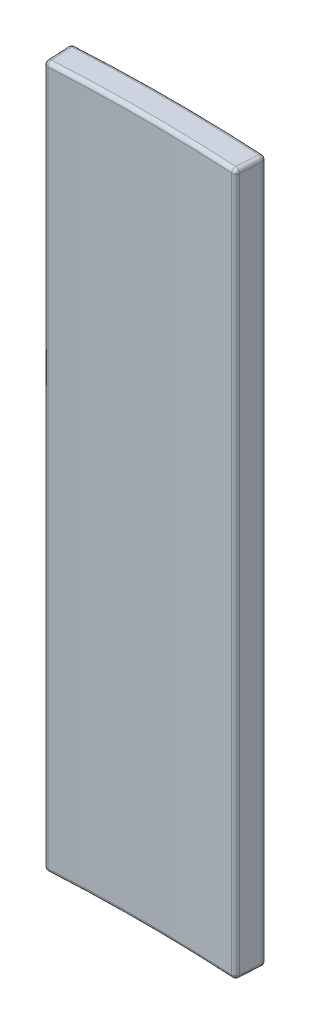
ISO-10303-21;
HEADER;
FILE_DESCRIPTION(('STEP AP214'),'2;1');
FILE_NAME('part.step','',(''),(''),'','','');
FILE_SCHEMA(('AUTOMOTIVE_DESIGN { 1 0 10303 214 1 1 1 1 }'));
ENDSEC;
DATA;
#1=APPLICATION_CONTEXT('core data for automotive mechanical design processes');
#2=APPLICATION_PROTOCOL_DEFINITION('international standard','automotive_design',2000,#1);
#3=PRODUCT_CONTEXT('',#1,'mechanical');
#4=PRODUCT('Part','Part','',(#3));
#5=PRODUCT_RELATED_PRODUCT_CATEGORY('part','',(#4));
#6=PRODUCT_DEFINITION_FORMATION('','',#4);
#7=PRODUCT_DEFINITION_CONTEXT('part definition',#1,'design');
#8=PRODUCT_DEFINITION('design','',#6,#7);
#9=PRODUCT_DEFINITION_SHAPE('','',#8);
#10=(LENGTH_UNIT() NAMED_UNIT(*) SI_UNIT(.MILLI.,.METRE.));
#11=(NAMED_UNIT(*) PLANE_ANGLE_UNIT() SI_UNIT($,.RADIAN.));
#12=(NAMED_UNIT(*) SI_UNIT($,.STERADIAN.) SOLID_ANGLE_UNIT());
#13=UNCERTAINTY_MEASURE_WITH_UNIT(LENGTH_MEASURE(1.E-05),#10,'distance_accuracy_value','');
#14=(GEOMETRIC_REPRESENTATION_CONTEXT(3) GLOBAL_UNCERTAINTY_ASSIGNED_CONTEXT((#13)) GLOBAL_UNIT_ASSIGNED_CONTEXT((#10,
#11,#12)) REPRESENTATION_CONTEXT('',''));
#15=CARTESIAN_POINT('',(0.,0.,0.));
#16=DIRECTION('',(0.,0.,1.));
#17=DIRECTION('',(1.,0.,0.));
#18=AXIS2_PLACEMENT_3D('',#15,#16,#17);
#19=CARTESIAN_POINT('',(0.,18.,0.));
#20=DIRECTION('',(0.,-1.,0.));
#21=DIRECTION('',(0.,0.,-1.));
#22=AXIS2_PLACEMENT_3D('',#19,#20,#21);
#23=CYLINDRICAL_SURFACE('',#22,42.5);
#24=CARTESIAN_POINT('',(0.,17.9,0.));
#25=DIRECTION('',(0.,-1.,0.));
#26=DIRECTION('',(0.,0.,-1.));
#27=AXIS2_PLACEMENT_3D('',#24,#25,#26);
#28=CIRCLE('',#27,42.5);
#29=CARTESIAN_POINT('',(-2.39993076653656,17.9,-42.4321850994717));
#30=VERTEX_POINT('',#29);
#31=CARTESIAN_POINT('',(2.39993076653656,17.9,-42.4321850994717));
#32=VERTEX_POINT('',#31);
#33=EDGE_CURVE('E43',#30,#32,#28,.T.);
#34=ORIENTED_EDGE('',*,*,#33,.T.);
#35=DIRECTION('',(0.,-1.,0.));
#36=VECTOR('',#35,1.);
#37=CARTESIAN_POINT('',(2.39993076653656,18.,-42.4321850994717));
#38=LINE('',#37,#36);
#39=CARTESIAN_POINT('',(2.39993076653656,0.0999999999999994,-42.4321850994717));
#40=VERTEX_POINT('',#39);
#41=EDGE_CURVE('E11',#32,#40,#38,.T.);
#42=ORIENTED_EDGE('',*,*,#41,.T.);
#43=CARTESIAN_POINT('',(0.,0.0999999999999994,0.));
#44=DIRECTION('',(0.,-1.,0.));
#45=DIRECTION('',(0.,0.,-1.));
#46=AXIS2_PLACEMENT_3D('',#43,#44,#45);
#47=CIRCLE('',#46,42.5);
#48=CARTESIAN_POINT('',(-2.39993076653656,0.0999999999999994,-42.4321850994717));
#49=VERTEX_POINT('',#48);
#50=EDGE_CURVE('E195',#40,#49,#47,.F.);
#51=ORIENTED_EDGE('',*,*,#50,.T.);
#52=DIRECTION('',(0.,-1.,0.));
#53=VECTOR('',#52,1.);
#54=CARTESIAN_POINT('',(-2.39993076653656,18.,-42.4321850994717));
#55=LINE('',#54,#53);
#56=EDGE_CURVE('E54',#49,#30,#55,.F.);
#57=ORIENTED_EDGE('',*,*,#56,.T.);
#58=EDGE_LOOP('',(#34,#42,#51,#57));
#59=FACE_BOUND('',#58,.T.);
#60=ADVANCED_FACE('F34',(#59),#23,.T.);
#61=CARTESIAN_POINT('',(-2.5,18.,-42.4264068711929));
#62=DIRECTION('',(0.998268396969244,0.,-0.0588235294117652));
#63=DIRECTION('',(-0.0588235294117652,0.,-0.998268396969244));
#64=AXIS2_PLACEMENT_3D('',#61,#62,#63);
#65=PLANE('',#64);
#66=DIRECTION('',(0.,-1.,0.));
#67=VECTOR('',#66,1.);
#68=CARTESIAN_POINT('',(-2.46175767797155,18.,-41.7774131455617));
#69=LINE('',#68,#67);
#70=CARTESIAN_POINT('',(-2.46175767797155,0.0999999999999994,-41.7774131455617));
#71=VERTEX_POINT('',#70);
#72=CARTESIAN_POINT('',(-2.46175767797155,17.9,-41.7774131455617));
#73=VERTEX_POINT('',#72);
#74=EDGE_CURVE('E129',#71,#73,#69,.F.);
#75=ORIENTED_EDGE('',*,*,#74,.T.);
#76=DIRECTION('',(0.0588235294117652,0.,0.998268396969244));
#77=VECTOR('',#76,1.);
#78=CARTESIAN_POINT('',(-2.5,17.9,-42.4264068711929));
#79=LINE('',#78,#77);
#80=CARTESIAN_POINT('',(-2.49411071031222,17.9,-42.3264623110024));
#81=VERTEX_POINT('',#80);
#82=EDGE_CURVE('E166',#73,#81,#79,.F.);
#83=ORIENTED_EDGE('',*,*,#82,.T.);
#84=DIRECTION('',(0.,-1.,0.));
#85=VECTOR('',#84,1.);
#86=CARTESIAN_POINT('',(-2.49411071031222,18.,-42.3264623110024));
#87=LINE('',#86,#85);
#88=CARTESIAN_POINT('',(-2.49411071031222,0.0999999999999994,-42.3264623110024));
#89=VERTEX_POINT('',#88);
#90=EDGE_CURVE('E159',#81,#89,#87,.T.);
#91=ORIENTED_EDGE('',*,*,#90,.T.);
#92=DIRECTION('',(0.0588235294117652,0.,0.998268396969244));
#93=VECTOR('',#92,1.);
#94=CARTESIAN_POINT('',(-2.45588235294118,0.0999999999999994,-41.6777055734659));
#95=LINE('',#94,#93);
#96=EDGE_CURVE('E157',#89,#71,#95,.T.);
#97=ORIENTED_EDGE('',*,*,#96,.T.);
#98=EDGE_LOOP('',(#75,#83,#91,#97));
#99=FACE_BOUND('',#98,.T.);
#100=ADVANCED_FACE('F307',(#99),#65,.F.);
#101=CARTESIAN_POINT('',(0.,18.,0.));
#102=DIRECTION('',(0.,-1.,0.));
#103=DIRECTION('',(0.,0.,-1.));
#104=AXIS2_PLACEMENT_3D('',#101,#102,#103);
#105=CYLINDRICAL_SURFACE('',#104,41.75);
#106=CARTESIAN_POINT('',(0.,17.9,0.));
#107=DIRECTION('',(0.,-1.,0.));
#108=DIRECTION('',(0.,0.,-1.));
#109=AXIS2_PLACEMENT_3D('',#106,#107,#108);
#110=CIRCLE('',#109,41.75);
#111=CARTESIAN_POINT('',(2.35628703698843,17.9,-41.6834548879927));
#112=VERTEX_POINT('',#111);
#113=CARTESIAN_POINT('',(-2.35628703698843,17.9,-41.6834548879927));
#114=VERTEX_POINT('',#113);
#115=EDGE_CURVE('E155',#112,#114,#110,.F.);
#116=ORIENTED_EDGE('',*,*,#115,.T.);
#117=DIRECTION('',(0.,-1.,0.));
#118=VECTOR('',#117,1.);
#119=CARTESIAN_POINT('',(-2.35628703698843,18.,-41.6834548879927));
#120=LINE('',#119,#118);
#121=CARTESIAN_POINT('',(-2.35628703698843,0.0999999999999994,-41.6834548879927));
#122=VERTEX_POINT('',#121);
#123=EDGE_CURVE('E127',#114,#122,#120,.T.);
#124=ORIENTED_EDGE('',*,*,#123,.T.);
#125=CARTESIAN_POINT('',(0.,0.0999999999999994,0.));
#126=DIRECTION('',(0.,-1.,0.));
#127=DIRECTION('',(0.,0.,-1.));
#128=AXIS2_PLACEMENT_3D('',#125,#126,#127);
#129=CIRCLE('',#128,41.75);
#130=CARTESIAN_POINT('',(2.35628703698843,0.0999999999999994,-41.6834548879927));
#131=VERTEX_POINT('',#130);
#132=EDGE_CURVE('E145',#122,#131,#129,.T.);
#133=ORIENTED_EDGE('',*,*,#132,.T.);
#134=DIRECTION('',(0.,-1.,0.));
#135=VECTOR('',#134,1.);
#136=CARTESIAN_POINT('',(2.35628703698843,18.,-41.6834548879927));
#137=LINE('',#136,#135);
#138=EDGE_CURVE('E151',#131,#112,#137,.F.);
#139=ORIENTED_EDGE('',*,*,#138,.T.);
#140=EDGE_LOOP('',(#116,#124,#133,#139));
#141=FACE_BOUND('',#140,.T.);
#142=ADVANCED_FACE('F153',(#141),#105,.F.);
#143=CARTESIAN_POINT('',(2.5,18.,-42.4264068711929));
#144=DIRECTION('',(-0.998268396969244,0.,-0.0588235294117652));
#145=DIRECTION('',(-0.0588235294117652,0.,0.998268396969244));
#146=AXIS2_PLACEMENT_3D('',#143,#144,#145);
#147=PLANE('',#146);
#148=DIRECTION('',(0.,-1.,0.));
#149=VECTOR('',#148,1.);
#150=CARTESIAN_POINT('',(2.46175767797155,18.,-41.7774131455617));
#151=LINE('',#150,#149);
#152=CARTESIAN_POINT('',(2.46175767797155,17.9,-41.7774131455617));
#153=VERTEX_POINT('',#152);
#154=CARTESIAN_POINT('',(2.46175767797155,0.0999999999999994,-41.7774131455617));
#155=VERTEX_POINT('',#154);
#156=EDGE_CURVE('E181',#153,#155,#151,.T.);
#157=ORIENTED_EDGE('',*,*,#156,.T.);
#158=DIRECTION('',(0.0588235294117652,0.,-0.998268396969244));
#159=VECTOR('',#158,1.);
#160=CARTESIAN_POINT('',(2.5,0.0999999999999994,-42.4264068711929));
#161=LINE('',#160,#159);
#162=CARTESIAN_POINT('',(2.49411071031222,0.0999999999999994,-42.3264623110024));
#163=VERTEX_POINT('',#162);
#164=EDGE_CURVE('E184',#155,#163,#161,.T.);
#165=ORIENTED_EDGE('',*,*,#164,.T.);
#166=DIRECTION('',(0.,-1.,0.));
#167=VECTOR('',#166,1.);
#168=CARTESIAN_POINT('',(2.49411071031222,18.,-42.3264623110024));
#169=LINE('',#168,#167);
#170=CARTESIAN_POINT('',(2.49411071031222,17.9,-42.3264623110024));
#171=VERTEX_POINT('',#170);
#172=EDGE_CURVE('E179',#163,#171,#169,.F.);
#173=ORIENTED_EDGE('',*,*,#172,.T.);
#174=DIRECTION('',(0.0588235294117652,0.,-0.998268396969244));
#175=VECTOR('',#174,1.);
#176=CARTESIAN_POINT('',(2.5,17.9,-42.4264068711929));
#177=LINE('',#176,#175);
#178=EDGE_CURVE('E177',#171,#153,#177,.F.);
#179=ORIENTED_EDGE('',*,*,#178,.T.);
#180=EDGE_LOOP('',(#157,#165,#173,#179));
#181=FACE_BOUND('',#180,.T.);
#182=ADVANCED_FACE('F280',(#181),#147,.F.);
#183=CARTESIAN_POINT('',(0.,18.,0.));
#184=DIRECTION('',(0.,-1.,0.));
#185=DIRECTION('',(0.,0.,-1.));
#186=AXIS2_PLACEMENT_3D('',#183,#184,#185);
#187=PLANE('',#186);
#188=CARTESIAN_POINT('',(0.,18.,0.));
#189=DIRECTION('',(0.,-1.,0.));
#190=DIRECTION('',(0.,0.,-1.));
#191=AXIS2_PLACEMENT_3D('',#188,#189,#190);
#192=CIRCLE('',#191,42.4);
#193=CARTESIAN_POINT('',(2.39428387061529,18.,-42.3323446639436));
#194=VERTEX_POINT('',#193);
#195=CARTESIAN_POINT('',(-2.39428387061529,18.,-42.3323446639436));
#196=VERTEX_POINT('',#195);
#197=EDGE_CURVE('E170',#194,#196,#192,.F.);
#198=ORIENTED_EDGE('',*,*,#197,.T.);
#199=DIRECTION('',(0.0588235294117652,0.,0.998268396969244));
#200=VECTOR('',#199,1.);
#201=CARTESIAN_POINT('',(0.0998268396969467,18.,-0.00588235294117784));
#202=LINE('',#201,#200);
#203=CARTESIAN_POINT('',(-2.36193083827463,18.,-41.7832954985028));
#204=VERTEX_POINT('',#203);
#205=EDGE_CURVE('E175',#196,#204,#202,.T.);
#206=ORIENTED_EDGE('',*,*,#205,.T.);
#207=CARTESIAN_POINT('',(0.,18.,0.));
#208=DIRECTION('',(0.,-1.,0.));
#209=DIRECTION('',(0.,0.,-1.));
#210=AXIS2_PLACEMENT_3D('',#207,#208,#209);
#211=CIRCLE('',#210,41.85);
#212=CARTESIAN_POINT('',(2.36193083827463,18.,-41.7832954985028));
#213=VERTEX_POINT('',#212);
#214=EDGE_CURVE('E172',#204,#213,#211,.T.);
#215=ORIENTED_EDGE('',*,*,#214,.T.);
#216=DIRECTION('',(0.0588235294117652,0.,-0.998268396969244));
#217=VECTOR('',#216,1.);
#218=CARTESIAN_POINT('',(-0.0998268396969471,18.,-0.00588235294117787));
#219=LINE('',#218,#217);
#220=EDGE_CURVE('E168',#213,#194,#219,.T.);
#221=ORIENTED_EDGE('',*,*,#220,.T.);
#222=EDGE_LOOP('',(#198,#206,#215,#221));
#223=FACE_BOUND('',#222,.T.);
#224=ADVANCED_FACE('F271',(#223),#187,.F.);
#225=CARTESIAN_POINT('',(0.,0.,0.));
#226=DIRECTION('',(0.,-1.,0.));
#227=DIRECTION('',(0.,0.,-1.));
#228=AXIS2_PLACEMENT_3D('',#225,#226,#227);
#229=PLANE('',#228);
#230=CARTESIAN_POINT('',(0.,0.,0.));
#231=DIRECTION('',(0.,-1.,0.));
#232=DIRECTION('',(0.,0.,-1.));
#233=AXIS2_PLACEMENT_3D('',#230,#231,#232);
#234=CIRCLE('',#233,41.85);
#235=CARTESIAN_POINT('',(2.36193083827463,0.,-41.7832954985028));
#236=VERTEX_POINT('',#235);
#237=CARTESIAN_POINT('',(-2.36193083827463,0.,-41.7832954985028));
#238=VERTEX_POINT('',#237);
#239=EDGE_CURVE('E190',#236,#238,#234,.F.);
#240=ORIENTED_EDGE('',*,*,#239,.T.);
#241=DIRECTION('',(0.0588235294117652,0.,0.998268396969244));
#242=VECTOR('',#241,1.);
#243=CARTESIAN_POINT('',(-2.40017316030308,0.,-42.432289224134));
#244=LINE('',#243,#242);
#245=CARTESIAN_POINT('',(-2.39428387061529,0.,-42.3323446639436));
#246=VERTEX_POINT('',#245);
#247=EDGE_CURVE('E193',#238,#246,#244,.F.);
#248=ORIENTED_EDGE('',*,*,#247,.T.);
#249=CARTESIAN_POINT('',(0.,0.,0.));
#250=DIRECTION('',(0.,-1.,0.));
#251=DIRECTION('',(0.,0.,-1.));
#252=AXIS2_PLACEMENT_3D('',#249,#250,#251);
#253=CIRCLE('',#252,42.4);
#254=CARTESIAN_POINT('',(2.39428387061529,0.,-42.3323446639436));
#255=VERTEX_POINT('',#254);
#256=EDGE_CURVE('E188',#246,#255,#253,.T.);
#257=ORIENTED_EDGE('',*,*,#256,.T.);
#258=DIRECTION('',(0.0588235294117652,0.,-0.998268396969244));
#259=VECTOR('',#258,1.);
#260=CARTESIAN_POINT('',(2.35605551324425,0.,-41.6835879264071));
#261=LINE('',#260,#259);
#262=EDGE_CURVE('E186',#255,#236,#261,.F.);
#263=ORIENTED_EDGE('',*,*,#262,.T.);
#264=EDGE_LOOP('',(#240,#248,#257,#263));
#265=FACE_BOUND('',#264,.T.);
#266=ADVANCED_FACE('F478',(#265),#229,.T.);
#267=CARTESIAN_POINT('',(2.39428387061529,18.,-42.3323446639436));
#268=DIRECTION('',(0.,-1.,0.));
#269=DIRECTION('',(0.,0.,-1.));
#270=AXIS2_PLACEMENT_3D('',#267,#268,#269);
#271=CYLINDRICAL_SURFACE('',#270,0.1);
#272=CARTESIAN_POINT('',(2.39428387061529,17.9,-42.3323446639436));
#273=DIRECTION('',(0.,1.,0.));
#274=DIRECTION('',(0.,0.,1.));
#275=AXIS2_PLACEMENT_3D('',#272,#273,#274);
#276=CIRCLE('',#275,0.1);
#277=EDGE_CURVE('E38',#171,#32,#276,.T.);
#278=ORIENTED_EDGE('',*,*,#277,.F.);
#279=ORIENTED_EDGE('',*,*,#172,.F.);
#280=CARTESIAN_POINT('',(2.39428387061529,0.0999999999999994,-42.3323446639436));
#281=DIRECTION('',(0.,-1.,0.));
#282=DIRECTION('',(0.,0.,-1.));
#283=AXIS2_PLACEMENT_3D('',#280,#281,#282);
#284=CIRCLE('',#283,0.1);
#285=EDGE_CURVE('E249',#40,#163,#284,.T.);
#286=ORIENTED_EDGE('',*,*,#285,.F.);
#287=ORIENTED_EDGE('',*,*,#41,.F.);
#288=EDGE_LOOP('',(#278,#279,#286,#287));
#289=FACE_BOUND('',#288,.T.);
#290=ADVANCED_FACE('F36',(#289),#271,.T.);
#291=CARTESIAN_POINT('',(2.39428387061529,17.9,-42.3323446639436));
#292=DIRECTION('',(0.,0.,1.));
#293=DIRECTION('',(1.,0.,0.));
#294=AXIS2_PLACEMENT_3D('',#291,#292,#293);
#295=SPHERICAL_SURFACE('',#294,0.1);
#296=CARTESIAN_POINT('',(2.39428387061529,17.9,-42.3323446639436));
#297=DIRECTION('',(0.0588235294117501,0.,-0.998268396969245));
#298=DIRECTION('',(-0.998268396969245,0.,-0.0588235294117501));
#299=AXIS2_PLACEMENT_3D('',#296,#297,#298);
#300=CIRCLE('',#299,0.1);
#301=EDGE_CURVE('E244',#171,#194,#300,.F.);
#302=ORIENTED_EDGE('',*,*,#301,.F.);
#303=ORIENTED_EDGE('',*,*,#277,.T.);
#304=CARTESIAN_POINT('',(2.39428387061529,17.9,-42.3323446639436));
#305=DIRECTION('',(0.998404355281688,0.,0.0564689592126246));
#306=DIRECTION('',(0.0564689592126246,0.,-0.998404355281688));
#307=AXIS2_PLACEMENT_3D('',#304,#305,#306);
#308=CIRCLE('',#307,0.1);
#309=EDGE_CURVE('E247',#194,#32,#308,.F.);
#310=ORIENTED_EDGE('',*,*,#309,.F.);
#311=EDGE_LOOP('',(#302,#303,#310));
#312=FACE_BOUND('',#311,.T.);
#313=ADVANCED_FACE('F260',(#312),#295,.T.);
#314=CARTESIAN_POINT('',(2.39428387061529,0.1,-42.3323446639436));
#315=DIRECTION('',(0.,0.,1.));
#316=DIRECTION('',(1.,0.,0.));
#317=AXIS2_PLACEMENT_3D('',#314,#315,#316);
#318=SPHERICAL_SURFACE('',#317,0.1);
#319=CARTESIAN_POINT('',(2.39428387061529,0.1,-42.3323446639436));
#320=DIRECTION('',(0.998404355281688,0.,0.0564689592126207));
#321=DIRECTION('',(0.0564689592126207,0.,-0.998404355281688));
#322=AXIS2_PLACEMENT_3D('',#319,#320,#321);
#323=CIRCLE('',#322,0.1);
#324=EDGE_CURVE('E238',#40,#255,#323,.F.);
#325=ORIENTED_EDGE('',*,*,#324,.F.);
#326=ORIENTED_EDGE('',*,*,#285,.T.);
#327=CARTESIAN_POINT('',(2.39428387061529,0.0999999999999994,-42.3323446639436));
#328=DIRECTION('',(0.0588235294117501,0.,-0.998268396969245));
#329=DIRECTION('',(-0.998268396969245,0.,-0.0588235294117501));
#330=AXIS2_PLACEMENT_3D('',#327,#328,#329);
#331=CIRCLE('',#330,0.1);
#332=EDGE_CURVE('E241',#255,#163,#331,.F.);
#333=ORIENTED_EDGE('',*,*,#332,.F.);
#334=EDGE_LOOP('',(#325,#326,#333));
#335=FACE_BOUND('',#334,.T.);
#336=ADVANCED_FACE('F457',(#335),#318,.T.);
#337=CARTESIAN_POINT('',(0.,17.9,0.));
#338=DIRECTION('',(0.,-1.,0.));
#339=DIRECTION('',(0.,0.,-1.));
#340=AXIS2_PLACEMENT_3D('',#337,#338,#339);
#341=TOROIDAL_SURFACE('',#340,42.4,0.1);
#342=ORIENTED_EDGE('',*,*,#309,.T.);
#343=ORIENTED_EDGE('',*,*,#33,.F.);
#344=CARTESIAN_POINT('',(-2.39428387061529,17.9,-42.3323446639436));
#345=DIRECTION('',(-0.998404355281688,0.,0.0564689592126207));
#346=DIRECTION('',(0.0564689592126207,0.,0.998404355281688));
#347=AXIS2_PLACEMENT_3D('',#344,#345,#346);
#348=CIRCLE('',#347,0.1);
#349=EDGE_CURVE('E232',#196,#30,#348,.T.);
#350=ORIENTED_EDGE('',*,*,#349,.F.);
#351=ORIENTED_EDGE('',*,*,#197,.F.);
#352=EDGE_LOOP('',(#342,#343,#350,#351));
#353=FACE_BOUND('',#352,.T.);
#354=ADVANCED_FACE('F266',(#353),#341,.T.);
#355=CARTESIAN_POINT('',(-0.0998268396969471,17.9,-0.00588235294117787));
#356=DIRECTION('',(0.0588235294117652,0.,-0.998268396969244));
#357=DIRECTION('',(-0.998268396969244,0.,-0.0588235294117652));
#358=AXIS2_PLACEMENT_3D('',#355,#356,#357);
#359=CYLINDRICAL_SURFACE('',#358,0.1);
#360=ORIENTED_EDGE('',*,*,#301,.T.);
#361=ORIENTED_EDGE('',*,*,#220,.F.);
#362=CARTESIAN_POINT('',(2.36193083827463,17.9,-41.7832954985028));
#363=DIRECTION('',(-0.0588235294117501,0.,0.998268396969245));
#364=DIRECTION('',(0.998268396969245,0.,0.0588235294117501));
#365=AXIS2_PLACEMENT_3D('',#362,#363,#364);
#366=CIRCLE('',#365,0.1);
#367=EDGE_CURVE('E229',#153,#213,#366,.T.);
#368=ORIENTED_EDGE('',*,*,#367,.F.);
#369=ORIENTED_EDGE('',*,*,#178,.F.);
#370=EDGE_LOOP('',(#360,#361,#368,#369));
#371=FACE_BOUND('',#370,.T.);
#372=ADVANCED_FACE('F277',(#371),#359,.T.);
#373=CARTESIAN_POINT('',(2.36193083827463,18.,-41.7832954985028));
#374=DIRECTION('',(0.,-1.,0.));
#375=DIRECTION('',(0.,0.,-1.));
#376=AXIS2_PLACEMENT_3D('',#373,#374,#375);
#377=CYLINDRICAL_SURFACE('',#376,0.1);
#378=CARTESIAN_POINT('',(2.36193083827463,0.0999999999999994,-41.7832954985028));
#379=DIRECTION('',(0.,-1.,0.));
#380=DIRECTION('',(0.,0.,-1.));
#381=AXIS2_PLACEMENT_3D('',#378,#379,#380);
#382=CIRCLE('',#381,0.1);
#383=EDGE_CURVE('E223',#155,#131,#382,.T.);
#384=ORIENTED_EDGE('',*,*,#383,.F.);
#385=ORIENTED_EDGE('',*,*,#156,.F.);
#386=CARTESIAN_POINT('',(2.36193083827463,17.9,-41.7832954985028));
#387=DIRECTION('',(0.,1.,0.));
#388=DIRECTION('',(0.,0.,1.));
#389=AXIS2_PLACEMENT_3D('',#386,#387,#388);
#390=CIRCLE('',#389,0.1);
#391=EDGE_CURVE('E226',#112,#153,#390,.T.);
#392=ORIENTED_EDGE('',*,*,#391,.F.);
#393=ORIENTED_EDGE('',*,*,#138,.F.);
#394=EDGE_LOOP('',(#384,#385,#392,#393));
#395=FACE_BOUND('',#394,.T.);
#396=ADVANCED_FACE('F284',(#395),#377,.T.);
#397=CARTESIAN_POINT('',(2.40017316030308,0.0999999999999994,-42.432289224134));
#398=DIRECTION('',(-0.0588235294117652,0.,0.998268396969244));
#399=DIRECTION('',(0.998268396969244,0.,0.0588235294117652));
#400=AXIS2_PLACEMENT_3D('',#397,#398,#399);
#401=CYLINDRICAL_SURFACE('',#400,0.1);
#402=ORIENTED_EDGE('',*,*,#332,.T.);
#403=ORIENTED_EDGE('',*,*,#164,.F.);
#404=CARTESIAN_POINT('',(2.36193083827463,0.1,-41.7832954985028));
#405=DIRECTION('',(-0.0588235294118193,0.,0.99826839696924));
#406=DIRECTION('',(0.998268396969241,0.,0.0588235294118193));
#407=AXIS2_PLACEMENT_3D('',#404,#405,#406);
#408=CIRCLE('',#407,0.1);
#409=EDGE_CURVE('E221',#236,#155,#408,.T.);
#410=ORIENTED_EDGE('',*,*,#409,.F.);
#411=ORIENTED_EDGE('',*,*,#262,.F.);
#412=EDGE_LOOP('',(#402,#403,#410,#411));
#413=FACE_BOUND('',#412,.T.);
#414=ADVANCED_FACE('F290',(#413),#401,.T.);
#415=CARTESIAN_POINT('',(0.,0.0999999999999994,0.));
#416=DIRECTION('',(0.,-1.,0.));
#417=DIRECTION('',(0.,0.,-1.));
#418=AXIS2_PLACEMENT_3D('',#415,#416,#417);
#419=TOROIDAL_SURFACE('',#418,42.4,0.1);
#420=ORIENTED_EDGE('',*,*,#324,.T.);
#421=ORIENTED_EDGE('',*,*,#256,.F.);
#422=CARTESIAN_POINT('',(-2.39428387061529,0.0999999999999994,-42.3323446639436));
#423=DIRECTION('',(-0.998404355281688,0.,0.0564689592126246));
#424=DIRECTION('',(0.0564689592126246,0.,0.998404355281688));
#425=AXIS2_PLACEMENT_3D('',#422,#423,#424);
#426=CIRCLE('',#425,0.1);
#427=EDGE_CURVE('E218',#49,#246,#426,.T.);
#428=ORIENTED_EDGE('',*,*,#427,.F.);
#429=ORIENTED_EDGE('',*,*,#50,.F.);
#430=EDGE_LOOP('',(#420,#421,#428,#429));
#431=FACE_BOUND('',#430,.T.);
#432=ADVANCED_FACE('F300',(#431),#419,.T.);
#433=CARTESIAN_POINT('',(-2.39428387061529,18.,-42.3323446639436));
#434=DIRECTION('',(0.,-1.,0.));
#435=DIRECTION('',(0.,0.,-1.));
#436=AXIS2_PLACEMENT_3D('',#433,#434,#435);
#437=CYLINDRICAL_SURFACE('',#436,0.1);
#438=CARTESIAN_POINT('',(-2.39428387061529,17.9,-42.3323446639436));
#439=DIRECTION('',(0.,1.,0.));
#440=DIRECTION('',(0.,0.,1.));
#441=AXIS2_PLACEMENT_3D('',#438,#439,#440);
#442=CIRCLE('',#441,0.1);
#443=EDGE_CURVE('E235',#30,#81,#442,.T.);
#444=ORIENTED_EDGE('',*,*,#443,.F.);
#445=ORIENTED_EDGE('',*,*,#56,.F.);
#446=CARTESIAN_POINT('',(-2.39428387061529,0.0999999999999994,-42.3323446639436));
#447=DIRECTION('',(0.,-1.,0.));
#448=DIRECTION('',(0.,0.,-1.));
#449=AXIS2_PLACEMENT_3D('',#446,#447,#448);
#450=CIRCLE('',#449,0.1);
#451=EDGE_CURVE('E215',#89,#49,#450,.T.);
#452=ORIENTED_EDGE('',*,*,#451,.F.);
#453=ORIENTED_EDGE('',*,*,#90,.F.);
#454=EDGE_LOOP('',(#444,#445,#452,#453));
#455=FACE_BOUND('',#454,.T.);
#456=ADVANCED_FACE('F296',(#455),#437,.T.);
#457=CARTESIAN_POINT('',(-2.39428387061529,17.9,-42.3323446639436));
#458=DIRECTION('',(0.,0.,1.));
#459=DIRECTION('',(1.,0.,0.));
#460=AXIS2_PLACEMENT_3D('',#457,#458,#459);
#461=SPHERICAL_SURFACE('',#460,0.1);
#462=ORIENTED_EDGE('',*,*,#349,.T.);
#463=ORIENTED_EDGE('',*,*,#443,.T.);
#464=CARTESIAN_POINT('',(-2.39428387061529,17.9,-42.3323446639436));
#465=DIRECTION('',(-0.0588235294117501,0.,-0.998268396969245));
#466=DIRECTION('',(-0.998268396969245,0.,0.0588235294117501));
#467=AXIS2_PLACEMENT_3D('',#464,#465,#466);
#468=CIRCLE('',#467,0.1);
#469=EDGE_CURVE('E212',#196,#81,#468,.F.);
#470=ORIENTED_EDGE('',*,*,#469,.F.);
#471=EDGE_LOOP('',(#462,#463,#470));
#472=FACE_BOUND('',#471,.T.);
#473=ADVANCED_FACE('F310',(#472),#461,.T.);
#474=CARTESIAN_POINT('',(2.36193083827463,17.9,-41.7832954985028));
#475=DIRECTION('',(0.,0.,1.));
#476=DIRECTION('',(1.,0.,0.));
#477=AXIS2_PLACEMENT_3D('',#474,#475,#476);
#478=SPHERICAL_SURFACE('',#477,0.1);
#479=ORIENTED_EDGE('',*,*,#391,.T.);
#480=ORIENTED_EDGE('',*,*,#367,.T.);
#481=CARTESIAN_POINT('',(2.36193083827463,17.9,-41.7832954985028));
#482=DIRECTION('',(0.998406105101621,0.,0.0564380128619949));
#483=DIRECTION('',(0.0564380128619949,0.,-0.998406105101621));
#484=AXIS2_PLACEMENT_3D('',#481,#482,#483);
#485=CIRCLE('',#484,0.1);
#486=EDGE_CURVE('E210',#112,#213,#485,.F.);
#487=ORIENTED_EDGE('',*,*,#486,.F.);
#488=EDGE_LOOP('',(#479,#480,#487));
#489=FACE_BOUND('',#488,.T.);
#490=ADVANCED_FACE('F320',(#489),#478,.T.);
#491=CARTESIAN_POINT('',(2.36193083827463,0.1,-41.7832954985028));
#492=DIRECTION('',(0.,0.,1.));
#493=DIRECTION('',(1.,0.,0.));
#494=AXIS2_PLACEMENT_3D('',#491,#492,#493);
#495=SPHERICAL_SURFACE('',#494,0.1);
#496=ORIENTED_EDGE('',*,*,#409,.T.);
#497=ORIENTED_EDGE('',*,*,#383,.T.);
#498=CARTESIAN_POINT('',(2.36193083827463,0.0999999999999994,-41.7832954985028));
#499=DIRECTION('',(0.998406105101621,0.,0.0564380128619988));
#500=DIRECTION('',(0.0564380128619988,0.,-0.998406105101621));
#501=AXIS2_PLACEMENT_3D('',#498,#499,#500);
#502=CIRCLE('',#501,0.1);
#503=EDGE_CURVE('E148',#236,#131,#502,.F.);
#504=ORIENTED_EDGE('',*,*,#503,.F.);
#505=EDGE_LOOP('',(#496,#497,#504));
#506=FACE_BOUND('',#505,.T.);
#507=ADVANCED_FACE('F322',(#506),#495,.T.);
#508=CARTESIAN_POINT('',(-2.39428387061529,0.1,-42.3323446639436));
#509=DIRECTION('',(0.,0.,1.));
#510=DIRECTION('',(1.,0.,0.));
#511=AXIS2_PLACEMENT_3D('',#508,#509,#510);
#512=SPHERICAL_SURFACE('',#511,0.1);
#513=ORIENTED_EDGE('',*,*,#451,.T.);
#514=ORIENTED_EDGE('',*,*,#427,.T.);
#515=CARTESIAN_POINT('',(-2.39428387061529,0.1,-42.3323446639436));
#516=DIRECTION('',(-0.0588235294117501,0.,-0.998268396969244));
#517=DIRECTION('',(-0.998268396969244,0.,0.0588235294117501));
#518=AXIS2_PLACEMENT_3D('',#515,#516,#517);
#519=CIRCLE('',#518,0.1);
#520=EDGE_CURVE('E206',#89,#246,#519,.F.);
#521=ORIENTED_EDGE('',*,*,#520,.F.);
#522=EDGE_LOOP('',(#513,#514,#521));
#523=FACE_BOUND('',#522,.T.);
#524=ADVANCED_FACE('F302',(#523),#512,.T.);
#525=CARTESIAN_POINT('',(0.0998268396969471,17.9,-0.00588235294117787));
#526=DIRECTION('',(0.0588235294117652,0.,0.998268396969244));
#527=DIRECTION('',(0.998268396969244,0.,-0.0588235294117652));
#528=AXIS2_PLACEMENT_3D('',#525,#526,#527);
#529=CYLINDRICAL_SURFACE('',#528,0.1);
#530=ORIENTED_EDGE('',*,*,#469,.T.);
#531=ORIENTED_EDGE('',*,*,#82,.F.);
#532=CARTESIAN_POINT('',(-2.36193083827463,17.9,-41.7832954985028));
#533=DIRECTION('',(0.0588235294118195,0.,0.99826839696924));
#534=DIRECTION('',(0.99826839696924,0.,-0.0588235294118195));
#535=AXIS2_PLACEMENT_3D('',#532,#533,#534);
#536=CIRCLE('',#535,0.1);
#537=EDGE_CURVE('E203',#204,#73,#536,.T.);
#538=ORIENTED_EDGE('',*,*,#537,.F.);
#539=ORIENTED_EDGE('',*,*,#205,.F.);
#540=EDGE_LOOP('',(#530,#531,#538,#539));
#541=FACE_BOUND('',#540,.T.);
#542=ADVANCED_FACE('F312',(#541),#529,.T.);
#543=CARTESIAN_POINT('',(0.,17.9,0.));
#544=DIRECTION('',(0.,-1.,0.));
#545=DIRECTION('',(0.,0.,-1.));
#546=AXIS2_PLACEMENT_3D('',#543,#544,#545);
#547=TOROIDAL_SURFACE('',#546,41.85,0.1);
#548=ORIENTED_EDGE('',*,*,#486,.T.);
#549=ORIENTED_EDGE('',*,*,#214,.F.);
#550=CARTESIAN_POINT('',(-2.36193083827463,17.9,-41.7832954985028));
#551=DIRECTION('',(-0.998406105101621,0.,0.0564380128619988));
#552=DIRECTION('',(0.0564380128619988,0.,0.998406105101621));
#553=AXIS2_PLACEMENT_3D('',#550,#551,#552);
#554=CIRCLE('',#553,0.1);
#555=EDGE_CURVE('E142',#114,#204,#554,.T.);
#556=ORIENTED_EDGE('',*,*,#555,.F.);
#557=ORIENTED_EDGE('',*,*,#115,.F.);
#558=EDGE_LOOP('',(#548,#549,#556,#557));
#559=FACE_BOUND('',#558,.T.);
#560=ADVANCED_FACE('F318',(#559),#547,.T.);
#561=CARTESIAN_POINT('',(0.,0.0999999999999994,0.));
#562=DIRECTION('',(0.,-1.,0.));
#563=DIRECTION('',(0.,0.,-1.));
#564=AXIS2_PLACEMENT_3D('',#561,#562,#563);
#565=TOROIDAL_SURFACE('',#564,41.85,0.1);
#566=ORIENTED_EDGE('',*,*,#503,.T.);
#567=ORIENTED_EDGE('',*,*,#132,.F.);
#568=CARTESIAN_POINT('',(-2.36193083827463,0.1,-41.7832954985028));
#569=DIRECTION('',(-0.998406105101621,0.,0.0564380128619949));
#570=DIRECTION('',(0.0564380128619949,0.,0.998406105101621));
#571=AXIS2_PLACEMENT_3D('',#568,#569,#570);
#572=CIRCLE('',#571,0.1);
#573=EDGE_CURVE('E134',#238,#122,#572,.T.);
#574=ORIENTED_EDGE('',*,*,#573,.F.);
#575=ORIENTED_EDGE('',*,*,#239,.F.);
#576=EDGE_LOOP('',(#566,#567,#574,#575));
#577=FACE_BOUND('',#576,.T.);
#578=ADVANCED_FACE('F146',(#577),#565,.T.);
#579=CARTESIAN_POINT('',(-2.40017316030308,0.0999999999999994,-42.432289224134));
#580=DIRECTION('',(-0.0588235294117652,0.,-0.998268396969244));
#581=DIRECTION('',(-0.998268396969244,0.,0.0588235294117652));
#582=AXIS2_PLACEMENT_3D('',#579,#580,#581);
#583=CYLINDRICAL_SURFACE('',#582,0.1);
#584=ORIENTED_EDGE('',*,*,#520,.T.);
#585=ORIENTED_EDGE('',*,*,#247,.F.);
#586=CARTESIAN_POINT('',(-2.36193083827463,0.0999999999999994,-41.7832954985028));
#587=DIRECTION('',(0.0588235294117501,0.,0.998268396969245));
#588=DIRECTION('',(0.998268396969245,0.,-0.0588235294117501));
#589=AXIS2_PLACEMENT_3D('',#586,#587,#588);
#590=CIRCLE('',#589,0.1);
#591=EDGE_CURVE('E138',#71,#238,#590,.T.);
#592=ORIENTED_EDGE('',*,*,#591,.F.);
#593=ORIENTED_EDGE('',*,*,#96,.F.);
#594=EDGE_LOOP('',(#584,#585,#592,#593));
#595=FACE_BOUND('',#594,.T.);
#596=ADVANCED_FACE('F305',(#595),#583,.T.);
#597=CARTESIAN_POINT('',(-2.36193083827463,17.9,-41.7832954985028));
#598=DIRECTION('',(0.,0.,1.));
#599=DIRECTION('',(1.,0.,0.));
#600=AXIS2_PLACEMENT_3D('',#597,#598,#599);
#601=SPHERICAL_SURFACE('',#600,0.1);
#602=ORIENTED_EDGE('',*,*,#555,.T.);
#603=ORIENTED_EDGE('',*,*,#537,.T.);
#604=CARTESIAN_POINT('',(-2.36193083827463,17.9,-41.7832954985028));
#605=DIRECTION('',(0.,1.,0.));
#606=DIRECTION('',(0.,0.,1.));
#607=AXIS2_PLACEMENT_3D('',#604,#605,#606);
#608=CIRCLE('',#607,0.1);
#609=EDGE_CURVE('E131',#114,#73,#608,.F.);
#610=ORIENTED_EDGE('',*,*,#609,.F.);
#611=EDGE_LOOP('',(#602,#603,#610));
#612=FACE_BOUND('',#611,.T.);
#613=ADVANCED_FACE('F316',(#612),#601,.T.);
#614=CARTESIAN_POINT('',(-2.36193083827463,0.1,-41.7832954985028));
#615=DIRECTION('',(0.,0.,1.));
#616=DIRECTION('',(1.,0.,0.));
#617=AXIS2_PLACEMENT_3D('',#614,#615,#616);
#618=SPHERICAL_SURFACE('',#617,0.1);
#619=ORIENTED_EDGE('',*,*,#591,.T.);
#620=ORIENTED_EDGE('',*,*,#573,.T.);
#621=CARTESIAN_POINT('',(-2.36193083827463,0.0999999999999994,-41.7832954985028));
#622=DIRECTION('',(0.,-1.,0.));
#623=DIRECTION('',(0.,0.,-1.));
#624=AXIS2_PLACEMENT_3D('',#621,#622,#623);
#625=CIRCLE('',#624,0.1);
#626=EDGE_CURVE('E123',#71,#122,#625,.F.);
#627=ORIENTED_EDGE('',*,*,#626,.F.);
#628=EDGE_LOOP('',(#619,#620,#627));
#629=FACE_BOUND('',#628,.T.);
#630=ADVANCED_FACE('F136',(#629),#618,.T.);
#631=CARTESIAN_POINT('',(-2.36193083827463,18.,-41.7832954985028));
#632=DIRECTION('',(0.,-1.,0.));
#633=DIRECTION('',(0.,0.,-1.));
#634=AXIS2_PLACEMENT_3D('',#631,#632,#633);
#635=CYLINDRICAL_SURFACE('',#634,0.1);
#636=ORIENTED_EDGE('',*,*,#609,.T.);
#637=ORIENTED_EDGE('',*,*,#74,.F.);
#638=ORIENTED_EDGE('',*,*,#626,.T.);
#639=ORIENTED_EDGE('',*,*,#123,.F.);
#640=EDGE_LOOP('',(#636,#637,#638,#639));
#641=FACE_BOUND('',#640,.T.);
#642=ADVANCED_FACE('F125',(#641),#635,.T.);
#643=CLOSED_SHELL('',(#60,#100,#142,#182,#224,#266,#290,#313,#336,#354,#372,#396,#414,#432,#456,
#473,#490,#507,#524,#542,#560,#578,#596,#613,#630,#642));
#644=MANIFOLD_SOLID_BREP('B2',#643);
#645=ADVANCED_BREP_SHAPE_REPRESENTATION('',(#18,#644),#14);
#646=SHAPE_DEFINITION_REPRESENTATION(#9,#645);
ENDSEC;
END-ISO-10303-21;
